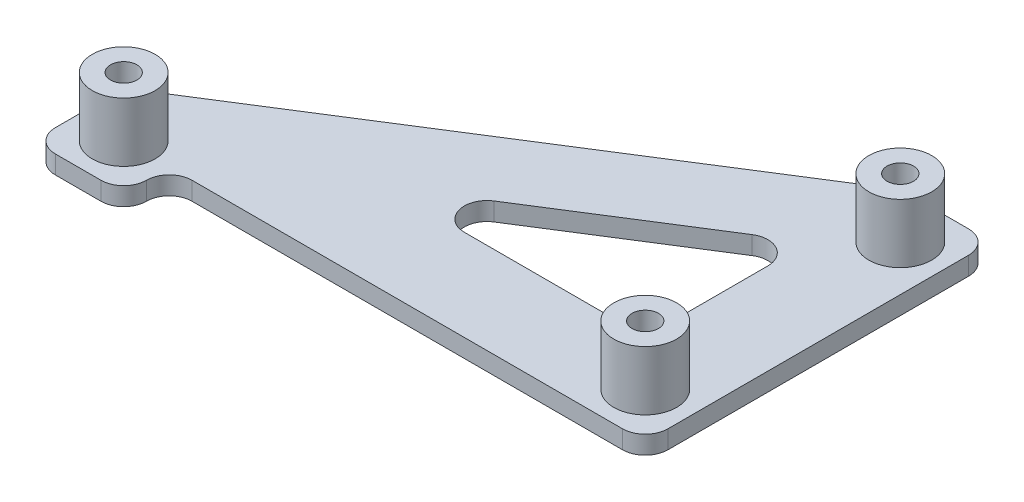
ISO-10303-21;
HEADER;
FILE_DESCRIPTION(('STEP AP214'),'2;1');
FILE_NAME('part.step','',(''),(''),'','','');
FILE_SCHEMA(('AUTOMOTIVE_DESIGN { 1 0 10303 214 1 1 1 1 }'));
ENDSEC;
DATA;
#1=APPLICATION_CONTEXT('core data for automotive mechanical design processes');
#2=APPLICATION_PROTOCOL_DEFINITION('international standard','automotive_design',2000,#1);
#3=PRODUCT_CONTEXT('',#1,'mechanical');
#4=PRODUCT('Part','Part','',(#3));
#5=PRODUCT_RELATED_PRODUCT_CATEGORY('part','',(#4));
#6=PRODUCT_DEFINITION_FORMATION('','',#4);
#7=PRODUCT_DEFINITION_CONTEXT('part definition',#1,'design');
#8=PRODUCT_DEFINITION('design','',#6,#7);
#9=PRODUCT_DEFINITION_SHAPE('','',#8);
#10=(LENGTH_UNIT() NAMED_UNIT(*) SI_UNIT(.MILLI.,.METRE.));
#11=(NAMED_UNIT(*) PLANE_ANGLE_UNIT() SI_UNIT($,.RADIAN.));
#12=(NAMED_UNIT(*) SI_UNIT($,.STERADIAN.) SOLID_ANGLE_UNIT());
#13=UNCERTAINTY_MEASURE_WITH_UNIT(LENGTH_MEASURE(1.E-05),#10,'distance_accuracy_value','');
#14=(GEOMETRIC_REPRESENTATION_CONTEXT(3) GLOBAL_UNCERTAINTY_ASSIGNED_CONTEXT((#13)) GLOBAL_UNIT_ASSIGNED_CONTEXT((#10,
#11,#12)) REPRESENTATION_CONTEXT('',''));
#15=CARTESIAN_POINT('',(0.,0.,0.));
#16=DIRECTION('',(0.,0.,1.));
#17=DIRECTION('',(1.,0.,0.));
#18=AXIS2_PLACEMENT_3D('',#15,#16,#17);
#19=CARTESIAN_POINT('',(0.,2.,0.));
#20=DIRECTION('',(0.,-1.,0.));
#21=DIRECTION('',(0.,0.,1.));
#22=AXIS2_PLACEMENT_3D('',#19,#20,#21);
#23=PLANE('',#22);
#24=CARTESIAN_POINT('',(0.,2.,0.));
#25=DIRECTION('',(0.,1.,0.));
#26=DIRECTION('',(0.,0.,1.));
#27=AXIS2_PLACEMENT_3D('',#24,#25,#26);
#28=CIRCLE('',#27,3.45);
#29=CARTESIAN_POINT('',(0.,2.,3.45));
#30=VERTEX_POINT('',#29);
#31=EDGE_CURVE('E254',#30,#30,#28,.F.);
#32=ORIENTED_EDGE('',*,*,#31,.T.);
#33=EDGE_LOOP('',(#32));
#34=FACE_BOUND('',#33,.T.);
#35=DIRECTION('',(-1.,0.,0.));
#36=VECTOR('',#35,1.);
#37=CARTESIAN_POINT('',(-5.,2.,-5.));
#38=LINE('',#37,#36);
#39=CARTESIAN_POINT('',(-7.5,2.,-5.));
#40=VERTEX_POINT('',#39);
#41=CARTESIAN_POINT('',(-24.8599572803658,2.,-5.));
#42=VERTEX_POINT('',#41);
#43=EDGE_CURVE('E179',#40,#42,#38,.T.);
#44=ORIENTED_EDGE('',*,*,#43,.T.);
#45=CARTESIAN_POINT('',(-24.8599572803658,2.,-7.5));
#46=DIRECTION('',(0.,1.,0.));
#47=DIRECTION('',(0.,0.,1.));
#48=AXIS2_PLACEMENT_3D('',#45,#46,#47);
#49=CIRCLE('',#48,2.5);
#50=CARTESIAN_POINT('',(-26.1949397588358,2.,-9.61372225757743));
#51=VERTEX_POINT('',#50);
#52=EDGE_CURVE('E194',#51,#42,#49,.T.);
#53=ORIENTED_EDGE('',*,*,#52,.F.);
#54=DIRECTION('',(0.845488903030971,0.,-0.533992991387981));
#55=VECTOR('',#54,1.);
#56=CARTESIAN_POINT('',(-33.5,2.,-5.));
#57=LINE('',#56,#55);
#58=CARTESIAN_POINT('',(-8.83498247846996,2.,-20.5779058030716));
#59=VERTEX_POINT('',#58);
#60=EDGE_CURVE('E379',#51,#59,#57,.T.);
#61=ORIENTED_EDGE('',*,*,#60,.T.);
#62=CARTESIAN_POINT('',(-7.5,2.,-18.4641835454942));
#63=DIRECTION('',(0.,1.,0.));
#64=DIRECTION('',(0.,0.,1.));
#65=AXIS2_PLACEMENT_3D('',#62,#63,#64);
#66=CIRCLE('',#65,2.5);
#67=CARTESIAN_POINT('',(-5.,2.,-18.4641835454942));
#68=VERTEX_POINT('',#67);
#69=EDGE_CURVE('E335',#68,#59,#66,.T.);
#70=ORIENTED_EDGE('',*,*,#69,.F.);
#71=DIRECTION('',(0.,0.,1.));
#72=VECTOR('',#71,1.);
#73=CARTESIAN_POINT('',(-5.,2.,-23.));
#74=LINE('',#73,#72);
#75=CARTESIAN_POINT('',(-5.,2.,-7.5));
#76=VERTEX_POINT('',#75);
#77=EDGE_CURVE('E211',#68,#76,#74,.T.);
#78=ORIENTED_EDGE('',*,*,#77,.T.);
#79=CARTESIAN_POINT('',(-7.5,2.,-7.5));
#80=DIRECTION('',(0.,1.,0.));
#81=DIRECTION('',(0.,0.,1.));
#82=AXIS2_PLACEMENT_3D('',#79,#80,#81);
#83=CIRCLE('',#82,2.5);
#84=EDGE_CURVE('E193',#40,#76,#83,.T.);
#85=ORIENTED_EDGE('',*,*,#84,.F.);
#86=EDGE_LOOP('',(#44,#53,#61,#70,#78,#85));
#87=FACE_BOUND('',#86,.T.);
#88=DIRECTION('',(0.845488903030971,0.,-0.533992991387982));
#89=VECTOR('',#88,1.);
#90=CARTESIAN_POINT('',(-4.99999999999999,2.,-33.));
#91=LINE('',#90,#89);
#92=CARTESIAN_POINT('',(-56.08498247847,2.,-0.73580053991372));
#93=VERTEX_POINT('',#92);
#94=CARTESIAN_POINT('',(-5.6116064255024,2.,-32.6137222575774));
#95=VERTEX_POINT('',#94);
#96=EDGE_CURVE('E230',#93,#95,#91,.T.);
#97=ORIENTED_EDGE('',*,*,#96,.F.);
#98=CARTESIAN_POINT('',(-54.75,2.,1.3779217176637));
#99=DIRECTION('',(0.,1.,0.));
#100=DIRECTION('',(0.,0.,1.));
#101=AXIS2_PLACEMENT_3D('',#98,#99,#100);
#102=CIRCLE('',#101,2.5);
#103=CARTESIAN_POINT('',(-57.25,2.,1.3779217176637));
#104=VERTEX_POINT('',#103);
#105=EDGE_CURVE('E309',#104,#93,#102,.F.);
#106=ORIENTED_EDGE('',*,*,#105,.F.);
#107=DIRECTION('',(0.,0.,-1.));
#108=VECTOR('',#107,1.);
#109=CARTESIAN_POINT('',(-57.25,2.,0.));
#110=LINE('',#109,#108);
#111=CARTESIAN_POINT('',(-57.25,2.,7.50000000000001));
#112=VERTEX_POINT('',#111);
#113=EDGE_CURVE('E228',#112,#104,#110,.T.);
#114=ORIENTED_EDGE('',*,*,#113,.F.);
#115=CARTESIAN_POINT('',(-54.75,2.,7.50000000000002));
#116=DIRECTION('',(0.,1.,0.));
#117=DIRECTION('',(0.,0.,1.));
#118=AXIS2_PLACEMENT_3D('',#115,#116,#117);
#119=CIRCLE('',#118,2.5);
#120=CARTESIAN_POINT('',(-54.75,2.,10.));
#121=VERTEX_POINT('',#120);
#122=EDGE_CURVE('E307',#121,#112,#119,.F.);
#123=ORIENTED_EDGE('',*,*,#122,.F.);
#124=DIRECTION('',(-1.,0.,0.));
#125=VECTOR('',#124,1.);
#126=CARTESIAN_POINT('',(-57.25,2.,10.));
#127=LINE('',#126,#125);
#128=CARTESIAN_POINT('',(-49.75,2.,10.));
#129=VERTEX_POINT('',#128);
#130=EDGE_CURVE('E225',#129,#121,#127,.T.);
#131=ORIENTED_EDGE('',*,*,#130,.F.);
#132=CARTESIAN_POINT('',(-49.75,2.,7.50000000000002));
#133=DIRECTION('',(0.,1.,0.));
#134=DIRECTION('',(0.,0.,1.));
#135=AXIS2_PLACEMENT_3D('',#132,#133,#134);
#136=CIRCLE('',#135,2.5);
#137=CARTESIAN_POINT('',(-47.25,2.,7.50000000000002));
#138=VERTEX_POINT('',#137);
#139=EDGE_CURVE('E298',#138,#129,#136,.F.);
#140=ORIENTED_EDGE('',*,*,#139,.F.);
#141=CARTESIAN_POINT('',(-44.75,2.,7.5));
#142=DIRECTION('',(0.,1.,0.));
#143=DIRECTION('',(0.,0.,1.));
#144=AXIS2_PLACEMENT_3D('',#141,#142,#143);
#145=CIRCLE('',#144,2.5);
#146=CARTESIAN_POINT('',(-44.75,2.,5.));
#147=VERTEX_POINT('',#146);
#148=EDGE_CURVE('E11',#147,#138,#145,.T.);
#149=ORIENTED_EDGE('',*,*,#148,.F.);
#150=DIRECTION('',(-1.,0.,0.));
#151=VECTOR('',#150,1.);
#152=CARTESIAN_POINT('',(-47.25,2.,5.));
#153=LINE('',#152,#151);
#154=CARTESIAN_POINT('',(2.5,2.,5.));
#155=VERTEX_POINT('',#154);
#156=EDGE_CURVE('E222',#155,#147,#153,.T.);
#157=ORIENTED_EDGE('',*,*,#156,.F.);
#158=CARTESIAN_POINT('',(2.5,2.,2.5));
#159=DIRECTION('',(0.,1.,0.));
#160=DIRECTION('',(0.,0.,1.));
#161=AXIS2_PLACEMENT_3D('',#158,#159,#160);
#162=CIRCLE('',#161,2.5);
#163=CARTESIAN_POINT('',(4.99999999999999,2.,2.5));
#164=VERTEX_POINT('',#163);
#165=EDGE_CURVE('E304',#164,#155,#162,.F.);
#166=ORIENTED_EDGE('',*,*,#165,.F.);
#167=DIRECTION('',(0.,0.,1.));
#168=VECTOR('',#167,1.);
#169=CARTESIAN_POINT('',(4.99999999999999,2.,5.));
#170=LINE('',#169,#168);
#171=CARTESIAN_POINT('',(5.,2.,-30.5));
#172=VERTEX_POINT('',#171);
#173=EDGE_CURVE('E218',#172,#164,#170,.T.);
#174=ORIENTED_EDGE('',*,*,#173,.F.);
#175=CARTESIAN_POINT('',(2.5,2.,-30.5));
#176=DIRECTION('',(0.,1.,0.));
#177=DIRECTION('',(0.,0.,1.));
#178=AXIS2_PLACEMENT_3D('',#175,#176,#177);
#179=CIRCLE('',#178,2.5);
#180=CARTESIAN_POINT('',(2.5,2.,-33.));
#181=VERTEX_POINT('',#180);
#182=EDGE_CURVE('E301',#181,#172,#179,.F.);
#183=ORIENTED_EDGE('',*,*,#182,.F.);
#184=DIRECTION('',(1.,0.,0.));
#185=VECTOR('',#184,1.);
#186=CARTESIAN_POINT('',(5.,2.,-33.));
#187=LINE('',#186,#185);
#188=CARTESIAN_POINT('',(-4.27662394703244,2.,-33.));
#189=VERTEX_POINT('',#188);
#190=EDGE_CURVE('E215',#189,#181,#187,.T.);
#191=ORIENTED_EDGE('',*,*,#190,.F.);
#192=CARTESIAN_POINT('',(-4.27662394703244,2.,-30.5));
#193=DIRECTION('',(0.,1.,0.));
#194=DIRECTION('',(0.,0.,1.));
#195=AXIS2_PLACEMENT_3D('',#192,#193,#194);
#196=CIRCLE('',#195,2.5);
#197=EDGE_CURVE('E311',#95,#189,#196,.F.);
#198=ORIENTED_EDGE('',*,*,#197,.F.);
#199=EDGE_LOOP('',(#97,#106,#114,#123,#131,#140,#149,#157,#166,#174,#183,#191,#198));
#200=FACE_BOUND('',#199,.T.);
#201=CARTESIAN_POINT('',(-52.25,2.,5.));
#202=DIRECTION('',(0.,1.,0.));
#203=DIRECTION('',(0.,0.,1.));
#204=AXIS2_PLACEMENT_3D('',#201,#202,#203);
#205=CIRCLE('',#204,3.45);
#206=CARTESIAN_POINT('',(-52.25,2.,8.45));
#207=VERTEX_POINT('',#206);
#208=EDGE_CURVE('E251',#207,#207,#205,.T.);
#209=ORIENTED_EDGE('',*,*,#208,.F.);
#210=EDGE_LOOP('',(#209));
#211=FACE_BOUND('',#210,.T.);
#212=CARTESIAN_POINT('',(0.,2.,-28.));
#213=DIRECTION('',(0.,1.,0.));
#214=DIRECTION('',(0.,0.,1.));
#215=AXIS2_PLACEMENT_3D('',#212,#213,#214);
#216=CIRCLE('',#215,3.45);
#217=CARTESIAN_POINT('',(0.,2.,-24.55));
#218=VERTEX_POINT('',#217);
#219=EDGE_CURVE('E184',#218,#218,#216,.F.);
#220=ORIENTED_EDGE('',*,*,#219,.T.);
#221=EDGE_LOOP('',(#220));
#222=FACE_BOUND('',#221,.T.);
#223=ADVANCED_FACE('F39',(#34,#87,#200,#211,#222),#23,.F.);
#224=CARTESIAN_POINT('',(-52.25,8.5,5.));
#225=DIRECTION('',(0.,-1.,0.));
#226=DIRECTION('',(0.,0.,1.));
#227=AXIS2_PLACEMENT_3D('',#224,#225,#226);
#228=CYLINDRICAL_SURFACE('',#227,3.45);
#229=CARTESIAN_POINT('',(-52.25,8.5,5.));
#230=DIRECTION('',(0.,-1.,0.));
#231=DIRECTION('',(0.,0.,-1.));
#232=AXIS2_PLACEMENT_3D('',#229,#230,#231);
#233=CIRCLE('',#232,3.45);
#234=CARTESIAN_POINT('',(-52.25,8.5,1.55));
#235=VERTEX_POINT('',#234);
#236=EDGE_CURVE('E255',#235,#235,#233,.T.);
#237=ORIENTED_EDGE('',*,*,#236,.T.);
#238=EDGE_LOOP('',(#237));
#239=FACE_BOUND('',#238,.T.);
#240=ORIENTED_EDGE('',*,*,#208,.T.);
#241=EDGE_LOOP('',(#240));
#242=FACE_BOUND('',#241,.T.);
#243=ADVANCED_FACE('F409',(#239,#242),#228,.T.);
#244=CARTESIAN_POINT('',(-52.25,8.5,5.));
#245=DIRECTION('',(0.,1.,0.));
#246=DIRECTION('',(0.,0.,-1.));
#247=AXIS2_PLACEMENT_3D('',#244,#245,#246);
#248=PLANE('',#247);
#249=ORIENTED_EDGE('',*,*,#236,.F.);
#250=EDGE_LOOP('',(#249));
#251=FACE_BOUND('',#250,.T.);
#252=CARTESIAN_POINT('',(-52.25,8.5,5.));
#253=DIRECTION('',(0.,-1.,0.));
#254=DIRECTION('',(0.,0.,-1.));
#255=AXIS2_PLACEMENT_3D('',#252,#253,#254);
#256=CIRCLE('',#255,1.45);
#257=CARTESIAN_POINT('',(-52.25,8.5,3.55));
#258=VERTEX_POINT('',#257);
#259=EDGE_CURVE('E256',#258,#258,#256,.T.);
#260=ORIENTED_EDGE('',*,*,#259,.T.);
#261=EDGE_LOOP('',(#260));
#262=FACE_BOUND('',#261,.T.);
#263=ADVANCED_FACE('F415',(#251,#262),#248,.T.);
#264=CARTESIAN_POINT('',(-52.25,0.,5.));
#265=DIRECTION('',(0.,1.,0.));
#266=DIRECTION('',(0.,0.,-1.));
#267=AXIS2_PLACEMENT_3D('',#264,#265,#266);
#268=PLANE('',#267);
#269=CARTESIAN_POINT('',(0.,0.,-28.));
#270=DIRECTION('',(0.,-1.,0.));
#271=DIRECTION('',(0.,0.,-1.));
#272=AXIS2_PLACEMENT_3D('',#269,#270,#271);
#273=CIRCLE('',#272,1.45);
#274=CARTESIAN_POINT('',(0.,0.,-29.45));
#275=VERTEX_POINT('',#274);
#276=EDGE_CURVE('E202',#275,#275,#273,.T.);
#277=ORIENTED_EDGE('',*,*,#276,.F.);
#278=EDGE_LOOP('',(#277));
#279=FACE_BOUND('',#278,.T.);
#280=CARTESIAN_POINT('',(-52.25,0.,5.));
#281=DIRECTION('',(0.,-1.,0.));
#282=DIRECTION('',(0.,0.,-1.));
#283=AXIS2_PLACEMENT_3D('',#280,#281,#282);
#284=CIRCLE('',#283,1.45);
#285=CARTESIAN_POINT('',(-52.25,0.,3.55));
#286=VERTEX_POINT('',#285);
#287=EDGE_CURVE('E233',#286,#286,#284,.T.);
#288=ORIENTED_EDGE('',*,*,#287,.F.);
#289=EDGE_LOOP('',(#288));
#290=FACE_BOUND('',#289,.T.);
#291=DIRECTION('',(1.,0.,0.));
#292=VECTOR('',#291,1.);
#293=CARTESIAN_POINT('',(5.,0.,-33.));
#294=LINE('',#293,#292);
#295=CARTESIAN_POINT('',(-4.27662394703244,0.,-33.));
#296=VERTEX_POINT('',#295);
#297=CARTESIAN_POINT('',(2.5,0.,-33.));
#298=VERTEX_POINT('',#297);
#299=EDGE_CURVE('E234',#296,#298,#294,.T.);
#300=ORIENTED_EDGE('',*,*,#299,.T.);
#301=CARTESIAN_POINT('',(2.5,0.,-30.5));
#302=DIRECTION('',(0.,-1.,0.));
#303=DIRECTION('',(0.,0.,-1.));
#304=AXIS2_PLACEMENT_3D('',#301,#302,#303);
#305=CIRCLE('',#304,2.5);
#306=CARTESIAN_POINT('',(5.,0.,-30.5));
#307=VERTEX_POINT('',#306);
#308=EDGE_CURVE('E280',#307,#298,#305,.F.);
#309=ORIENTED_EDGE('',*,*,#308,.F.);
#310=DIRECTION('',(0.,0.,1.));
#311=VECTOR('',#310,1.);
#312=CARTESIAN_POINT('',(4.99999999999999,0.,5.));
#313=LINE('',#312,#311);
#314=CARTESIAN_POINT('',(4.99999999999999,0.,2.5));
#315=VERTEX_POINT('',#314);
#316=EDGE_CURVE('E237',#307,#315,#313,.T.);
#317=ORIENTED_EDGE('',*,*,#316,.T.);
#318=CARTESIAN_POINT('',(2.5,0.,2.5));
#319=DIRECTION('',(0.,-1.,0.));
#320=DIRECTION('',(0.,0.,-1.));
#321=AXIS2_PLACEMENT_3D('',#318,#319,#320);
#322=CIRCLE('',#321,2.5);
#323=CARTESIAN_POINT('',(2.5,0.,5.));
#324=VERTEX_POINT('',#323);
#325=EDGE_CURVE('E283',#324,#315,#322,.F.);
#326=ORIENTED_EDGE('',*,*,#325,.F.);
#327=DIRECTION('',(-1.,0.,0.));
#328=VECTOR('',#327,1.);
#329=CARTESIAN_POINT('',(-47.25,0.,5.));
#330=LINE('',#329,#328);
#331=CARTESIAN_POINT('',(-44.75,0.,5.));
#332=VERTEX_POINT('',#331);
#333=EDGE_CURVE('E240',#324,#332,#330,.T.);
#334=ORIENTED_EDGE('',*,*,#333,.T.);
#335=CARTESIAN_POINT('',(-44.75,0.,7.5));
#336=DIRECTION('',(0.,-1.,0.));
#337=DIRECTION('',(0.,0.,-1.));
#338=AXIS2_PLACEMENT_3D('',#335,#336,#337);
#339=CIRCLE('',#338,2.5);
#340=CARTESIAN_POINT('',(-47.25,0.,7.50000000000002));
#341=VERTEX_POINT('',#340);
#342=EDGE_CURVE('E48',#341,#332,#339,.T.);
#343=ORIENTED_EDGE('',*,*,#342,.F.);
#344=CARTESIAN_POINT('',(-49.75,0.,7.50000000000002));
#345=DIRECTION('',(0.,-1.,0.));
#346=DIRECTION('',(0.,0.,-1.));
#347=AXIS2_PLACEMENT_3D('',#344,#345,#346);
#348=CIRCLE('',#347,2.5);
#349=CARTESIAN_POINT('',(-49.75,0.,10.));
#350=VERTEX_POINT('',#349);
#351=EDGE_CURVE('E277',#350,#341,#348,.F.);
#352=ORIENTED_EDGE('',*,*,#351,.F.);
#353=DIRECTION('',(-1.,0.,0.));
#354=VECTOR('',#353,1.);
#355=CARTESIAN_POINT('',(-57.25,0.,10.));
#356=LINE('',#355,#354);
#357=CARTESIAN_POINT('',(-54.75,0.,10.));
#358=VERTEX_POINT('',#357);
#359=EDGE_CURVE('E243',#350,#358,#356,.T.);
#360=ORIENTED_EDGE('',*,*,#359,.T.);
#361=CARTESIAN_POINT('',(-54.75,0.,7.50000000000002));
#362=DIRECTION('',(0.,-1.,0.));
#363=DIRECTION('',(0.,0.,-1.));
#364=AXIS2_PLACEMENT_3D('',#361,#362,#363);
#365=CIRCLE('',#364,2.5);
#366=CARTESIAN_POINT('',(-57.25,0.,7.50000000000001));
#367=VERTEX_POINT('',#366);
#368=EDGE_CURVE('E286',#367,#358,#365,.F.);
#369=ORIENTED_EDGE('',*,*,#368,.F.);
#370=DIRECTION('',(0.,0.,-1.));
#371=VECTOR('',#370,1.);
#372=CARTESIAN_POINT('',(-57.25,0.,0.));
#373=LINE('',#372,#371);
#374=CARTESIAN_POINT('',(-57.25,0.,1.3779217176637));
#375=VERTEX_POINT('',#374);
#376=EDGE_CURVE('E246',#367,#375,#373,.T.);
#377=ORIENTED_EDGE('',*,*,#376,.T.);
#378=CARTESIAN_POINT('',(-54.75,0.,1.3779217176637));
#379=DIRECTION('',(0.,-1.,0.));
#380=DIRECTION('',(0.,0.,-1.));
#381=AXIS2_PLACEMENT_3D('',#378,#379,#380);
#382=CIRCLE('',#381,2.5);
#383=CARTESIAN_POINT('',(-56.08498247847,0.,-0.73580053991372));
#384=VERTEX_POINT('',#383);
#385=EDGE_CURVE('E289',#384,#375,#382,.F.);
#386=ORIENTED_EDGE('',*,*,#385,.F.);
#387=DIRECTION('',(0.845488903030971,0.,-0.533992991387982));
#388=VECTOR('',#387,1.);
#389=CARTESIAN_POINT('',(-4.99999999999999,0.,-33.));
#390=LINE('',#389,#388);
#391=CARTESIAN_POINT('',(-5.6116064255024,0.,-32.6137222575774));
#392=VERTEX_POINT('',#391);
#393=EDGE_CURVE('E219',#384,#392,#390,.T.);
#394=ORIENTED_EDGE('',*,*,#393,.T.);
#395=CARTESIAN_POINT('',(-4.27662394703244,0.,-30.5));
#396=DIRECTION('',(0.,-1.,0.));
#397=DIRECTION('',(0.,0.,-1.));
#398=AXIS2_PLACEMENT_3D('',#395,#396,#397);
#399=CIRCLE('',#398,2.5);
#400=EDGE_CURVE('E291',#296,#392,#399,.F.);
#401=ORIENTED_EDGE('',*,*,#400,.F.);
#402=EDGE_LOOP('',(#300,#309,#317,#326,#334,#343,#352,#360,#369,#377,#386,#394,#401));
#403=FACE_BOUND('',#402,.T.);
#404=DIRECTION('',(0.845488903030971,0.,-0.533992991387981));
#405=VECTOR('',#404,1.);
#406=CARTESIAN_POINT('',(-33.5,0.,-5.));
#407=LINE('',#406,#405);
#408=CARTESIAN_POINT('',(-26.1949397588358,0.,-9.61372225757743));
#409=VERTEX_POINT('',#408);
#410=CARTESIAN_POINT('',(-8.83498247846996,0.,-20.5779058030716));
#411=VERTEX_POINT('',#410);
#412=EDGE_CURVE('E201',#409,#411,#407,.T.);
#413=ORIENTED_EDGE('',*,*,#412,.F.);
#414=CARTESIAN_POINT('',(-24.8599572803658,0.,-7.5));
#415=DIRECTION('',(0.,-1.,0.));
#416=DIRECTION('',(0.,0.,-1.));
#417=AXIS2_PLACEMENT_3D('',#414,#415,#416);
#418=CIRCLE('',#417,2.5);
#419=CARTESIAN_POINT('',(-24.8599572803658,0.,-5.));
#420=VERTEX_POINT('',#419);
#421=EDGE_CURVE('E200',#420,#409,#418,.T.);
#422=ORIENTED_EDGE('',*,*,#421,.F.);
#423=DIRECTION('',(-1.,0.,0.));
#424=VECTOR('',#423,1.);
#425=CARTESIAN_POINT('',(-5.,0.,-5.));
#426=LINE('',#425,#424);
#427=CARTESIAN_POINT('',(-7.5,0.,-5.));
#428=VERTEX_POINT('',#427);
#429=EDGE_CURVE('E176',#428,#420,#426,.T.);
#430=ORIENTED_EDGE('',*,*,#429,.F.);
#431=CARTESIAN_POINT('',(-7.5,0.,-7.5));
#432=DIRECTION('',(0.,-1.,0.));
#433=DIRECTION('',(0.,0.,-1.));
#434=AXIS2_PLACEMENT_3D('',#431,#432,#433);
#435=CIRCLE('',#434,2.5);
#436=CARTESIAN_POINT('',(-5.,0.,-7.5));
#437=VERTEX_POINT('',#436);
#438=EDGE_CURVE('E187',#437,#428,#435,.T.);
#439=ORIENTED_EDGE('',*,*,#438,.F.);
#440=DIRECTION('',(0.,0.,1.));
#441=VECTOR('',#440,1.);
#442=CARTESIAN_POINT('',(-5.,0.,-23.));
#443=LINE('',#442,#441);
#444=CARTESIAN_POINT('',(-5.,0.,-18.4641835454942));
#445=VERTEX_POINT('',#444);
#446=EDGE_CURVE('E205',#445,#437,#443,.T.);
#447=ORIENTED_EDGE('',*,*,#446,.F.);
#448=CARTESIAN_POINT('',(-7.5,0.,-18.4641835454942));
#449=DIRECTION('',(0.,-1.,0.));
#450=DIRECTION('',(0.,0.,-1.));
#451=AXIS2_PLACEMENT_3D('',#448,#449,#450);
#452=CIRCLE('',#451,2.5);
#453=EDGE_CURVE('E332',#411,#445,#452,.T.);
#454=ORIENTED_EDGE('',*,*,#453,.F.);
#455=EDGE_LOOP('',(#413,#422,#430,#439,#447,#454));
#456=FACE_BOUND('',#455,.T.);
#457=CARTESIAN_POINT('',(0.,0.,0.));
#458=DIRECTION('',(0.,-1.,0.));
#459=DIRECTION('',(0.,0.,-1.));
#460=AXIS2_PLACEMENT_3D('',#457,#458,#459);
#461=CIRCLE('',#460,1.45);
#462=CARTESIAN_POINT('',(0.,0.,-1.45));
#463=VERTEX_POINT('',#462);
#464=EDGE_CURVE('E208',#463,#463,#461,.T.);
#465=ORIENTED_EDGE('',*,*,#464,.F.);
#466=EDGE_LOOP('',(#465));
#467=FACE_BOUND('',#466,.T.);
#468=ADVANCED_FACE('F197',(#279,#290,#403,#456,#467),#268,.F.);
#469=CARTESIAN_POINT('',(-52.25,8.5,5.));
#470=DIRECTION('',(0.,-1.,0.));
#471=DIRECTION('',(0.,0.,1.));
#472=AXIS2_PLACEMENT_3D('',#469,#470,#471);
#473=CYLINDRICAL_SURFACE('',#472,1.45);
#474=ORIENTED_EDGE('',*,*,#287,.T.);
#475=EDGE_LOOP('',(#474));
#476=FACE_BOUND('',#475,.T.);
#477=ORIENTED_EDGE('',*,*,#259,.F.);
#478=EDGE_LOOP('',(#477));
#479=FACE_BOUND('',#478,.T.);
#480=ADVANCED_FACE('F440',(#476,#479),#473,.F.);
#481=CARTESIAN_POINT('',(5.,2.,-33.));
#482=DIRECTION('',(0.,0.,1.));
#483=DIRECTION('',(-1.,0.,0.));
#484=AXIS2_PLACEMENT_3D('',#481,#482,#483);
#485=PLANE('',#484);
#486=ORIENTED_EDGE('',*,*,#190,.T.);
#487=DIRECTION('',(0.,-1.,0.));
#488=VECTOR('',#487,1.);
#489=CARTESIAN_POINT('',(2.5,2.,-33.));
#490=LINE('',#489,#488);
#491=EDGE_CURVE('E273',#298,#181,#490,.F.);
#492=ORIENTED_EDGE('',*,*,#491,.F.);
#493=ORIENTED_EDGE('',*,*,#299,.F.);
#494=DIRECTION('',(0.,-1.,0.));
#495=VECTOR('',#494,1.);
#496=CARTESIAN_POINT('',(-4.27662394703244,2.,-33.));
#497=LINE('',#496,#495);
#498=EDGE_CURVE('E275',#189,#296,#497,.T.);
#499=ORIENTED_EDGE('',*,*,#498,.F.);
#500=EDGE_LOOP('',(#486,#492,#493,#499));
#501=FACE_BOUND('',#500,.T.);
#502=ADVANCED_FACE('F436',(#501),#485,.F.);
#503=CARTESIAN_POINT('',(4.99999999999999,2.,5.));
#504=DIRECTION('',(-1.,0.,0.));
#505=DIRECTION('',(0.,0.,-1.));
#506=AXIS2_PLACEMENT_3D('',#503,#504,#505);
#507=PLANE('',#506);
#508=ORIENTED_EDGE('',*,*,#316,.F.);
#509=DIRECTION('',(0.,-1.,0.));
#510=VECTOR('',#509,1.);
#511=CARTESIAN_POINT('',(5.,2.,-30.5));
#512=LINE('',#511,#510);
#513=EDGE_CURVE('E324',#172,#307,#512,.T.);
#514=ORIENTED_EDGE('',*,*,#513,.F.);
#515=ORIENTED_EDGE('',*,*,#173,.T.);
#516=DIRECTION('',(0.,-1.,0.));
#517=VECTOR('',#516,1.);
#518=CARTESIAN_POINT('',(4.99999999999999,2.,2.5));
#519=LINE('',#518,#517);
#520=EDGE_CURVE('E326',#315,#164,#519,.F.);
#521=ORIENTED_EDGE('',*,*,#520,.F.);
#522=EDGE_LOOP('',(#508,#514,#515,#521));
#523=FACE_BOUND('',#522,.T.);
#524=ADVANCED_FACE('F433',(#523),#507,.F.);
#525=CARTESIAN_POINT('',(-47.25,2.,5.));
#526=DIRECTION('',(0.,0.,-1.));
#527=DIRECTION('',(1.,0.,0.));
#528=AXIS2_PLACEMENT_3D('',#525,#526,#527);
#529=PLANE('',#528);
#530=ORIENTED_EDGE('',*,*,#333,.F.);
#531=DIRECTION('',(0.,-1.,0.));
#532=VECTOR('',#531,1.);
#533=CARTESIAN_POINT('',(2.5,2.,5.));
#534=LINE('',#533,#532);
#535=EDGE_CURVE('E320',#155,#324,#534,.T.);
#536=ORIENTED_EDGE('',*,*,#535,.F.);
#537=ORIENTED_EDGE('',*,*,#156,.T.);
#538=DIRECTION('',(0.,-1.,0.));
#539=VECTOR('',#538,1.);
#540=CARTESIAN_POINT('',(-44.75,2.,5.));
#541=LINE('',#540,#539);
#542=EDGE_CURVE('E322',#332,#147,#541,.F.);
#543=ORIENTED_EDGE('',*,*,#542,.F.);
#544=EDGE_LOOP('',(#530,#536,#537,#543));
#545=FACE_BOUND('',#544,.T.);
#546=ADVANCED_FACE('F347',(#545),#529,.F.);
#547=CARTESIAN_POINT('',(-57.25,2.,10.));
#548=DIRECTION('',(0.,0.,-1.));
#549=DIRECTION('',(1.,0.,0.));
#550=AXIS2_PLACEMENT_3D('',#547,#548,#549);
#551=PLANE('',#550);
#552=ORIENTED_EDGE('',*,*,#359,.F.);
#553=DIRECTION('',(0.,-1.,0.));
#554=VECTOR('',#553,1.);
#555=CARTESIAN_POINT('',(-49.75,2.,10.));
#556=LINE('',#555,#554);
#557=EDGE_CURVE('E316',#129,#350,#556,.T.);
#558=ORIENTED_EDGE('',*,*,#557,.F.);
#559=ORIENTED_EDGE('',*,*,#130,.T.);
#560=DIRECTION('',(0.,-1.,0.));
#561=VECTOR('',#560,1.);
#562=CARTESIAN_POINT('',(-54.75,2.,10.));
#563=LINE('',#562,#561);
#564=EDGE_CURVE('E318',#358,#121,#563,.F.);
#565=ORIENTED_EDGE('',*,*,#564,.F.);
#566=EDGE_LOOP('',(#552,#558,#559,#565));
#567=FACE_BOUND('',#566,.T.);
#568=ADVANCED_FACE('F427',(#567),#551,.F.);
#569=CARTESIAN_POINT('',(-57.25,2.,0.));
#570=DIRECTION('',(1.,0.,0.));
#571=DIRECTION('',(0.,0.,1.));
#572=AXIS2_PLACEMENT_3D('',#569,#570,#571);
#573=PLANE('',#572);
#574=ORIENTED_EDGE('',*,*,#376,.F.);
#575=DIRECTION('',(0.,-1.,0.));
#576=VECTOR('',#575,1.);
#577=CARTESIAN_POINT('',(-57.25,2.,7.50000000000001));
#578=LINE('',#577,#576);
#579=EDGE_CURVE('E62',#112,#367,#578,.T.);
#580=ORIENTED_EDGE('',*,*,#579,.F.);
#581=ORIENTED_EDGE('',*,*,#113,.T.);
#582=DIRECTION('',(0.,-1.,0.));
#583=VECTOR('',#582,1.);
#584=CARTESIAN_POINT('',(-57.25,2.,1.3779217176637));
#585=LINE('',#584,#583);
#586=EDGE_CURVE('E55',#375,#104,#585,.F.);
#587=ORIENTED_EDGE('',*,*,#586,.F.);
#588=EDGE_LOOP('',(#574,#580,#581,#587));
#589=FACE_BOUND('',#588,.T.);
#590=ADVANCED_FACE('F423',(#589),#573,.F.);
#591=CARTESIAN_POINT('',(-4.99999999999999,2.,-33.));
#592=DIRECTION('',(0.533992991387982,0.,0.845488903030971));
#593=DIRECTION('',(-0.845488903030971,0.,0.533992991387982));
#594=AXIS2_PLACEMENT_3D('',#591,#592,#593);
#595=PLANE('',#594);
#596=ORIENTED_EDGE('',*,*,#393,.F.);
#597=DIRECTION('',(0.,-1.,0.));
#598=VECTOR('',#597,1.);
#599=CARTESIAN_POINT('',(-56.08498247847,2.,-0.735800539913727));
#600=LINE('',#599,#598);
#601=EDGE_CURVE('E294',#93,#384,#600,.T.);
#602=ORIENTED_EDGE('',*,*,#601,.F.);
#603=ORIENTED_EDGE('',*,*,#96,.T.);
#604=DIRECTION('',(0.,-1.,0.));
#605=VECTOR('',#604,1.);
#606=CARTESIAN_POINT('',(-5.6116064255024,2.,-32.6137222575774));
#607=LINE('',#606,#605);
#608=EDGE_CURVE('E296',#392,#95,#607,.F.);
#609=ORIENTED_EDGE('',*,*,#608,.F.);
#610=EDGE_LOOP('',(#596,#602,#603,#609));
#611=FACE_BOUND('',#610,.T.);
#612=ADVANCED_FACE('F420',(#611),#595,.F.);
#613=CARTESIAN_POINT('',(-5.,2.,-5.));
#614=DIRECTION('',(0.,0.,-1.));
#615=DIRECTION('',(1.,0.,0.));
#616=AXIS2_PLACEMENT_3D('',#613,#614,#615);
#617=PLANE('',#616);
#618=ORIENTED_EDGE('',*,*,#43,.F.);
#619=DIRECTION('',(0.,-1.,0.));
#620=VECTOR('',#619,1.);
#621=CARTESIAN_POINT('',(-7.5,2.,-5.));
#622=LINE('',#621,#620);
#623=EDGE_CURVE('E172',#428,#40,#622,.F.);
#624=ORIENTED_EDGE('',*,*,#623,.F.);
#625=ORIENTED_EDGE('',*,*,#429,.T.);
#626=DIRECTION('',(0.,-1.,0.));
#627=VECTOR('',#626,1.);
#628=CARTESIAN_POINT('',(-24.8599572803658,0.,-5.));
#629=LINE('',#628,#627);
#630=EDGE_CURVE('E183',#42,#420,#629,.T.);
#631=ORIENTED_EDGE('',*,*,#630,.F.);
#632=EDGE_LOOP('',(#618,#624,#625,#631));
#633=FACE_BOUND('',#632,.T.);
#634=ADVANCED_FACE('F174',(#633),#617,.T.);
#635=CARTESIAN_POINT('',(-33.5,2.,-5.));
#636=DIRECTION('',(0.533992991387982,0.,0.845488903030971));
#637=DIRECTION('',(-0.845488903030971,0.,0.533992991387981));
#638=AXIS2_PLACEMENT_3D('',#635,#636,#637);
#639=PLANE('',#638);
#640=ORIENTED_EDGE('',*,*,#412,.T.);
#641=DIRECTION('',(0.,-1.,0.));
#642=VECTOR('',#641,1.);
#643=CARTESIAN_POINT('',(-8.83498247846996,0.,-20.5779058030716));
#644=LINE('',#643,#642);
#645=EDGE_CURVE('E266',#59,#411,#644,.T.);
#646=ORIENTED_EDGE('',*,*,#645,.F.);
#647=ORIENTED_EDGE('',*,*,#60,.F.);
#648=DIRECTION('',(0.,-1.,0.));
#649=VECTOR('',#648,1.);
#650=CARTESIAN_POINT('',(-26.1949397588358,2.,-9.61372225757743));
#651=LINE('',#650,#649);
#652=EDGE_CURVE('E268',#409,#51,#651,.F.);
#653=ORIENTED_EDGE('',*,*,#652,.F.);
#654=EDGE_LOOP('',(#640,#646,#647,#653));
#655=FACE_BOUND('',#654,.T.);
#656=ADVANCED_FACE('F392',(#655),#639,.T.);
#657=CARTESIAN_POINT('',(-5.,2.,-23.));
#658=DIRECTION('',(-1.,0.,0.));
#659=DIRECTION('',(0.,0.,-1.));
#660=AXIS2_PLACEMENT_3D('',#657,#658,#659);
#661=PLANE('',#660);
#662=ORIENTED_EDGE('',*,*,#77,.F.);
#663=DIRECTION('',(0.,-1.,0.));
#664=VECTOR('',#663,1.);
#665=CARTESIAN_POINT('',(-5.,2.,-18.4641835454942));
#666=LINE('',#665,#664);
#667=EDGE_CURVE('E270',#445,#68,#666,.F.);
#668=ORIENTED_EDGE('',*,*,#667,.F.);
#669=ORIENTED_EDGE('',*,*,#446,.T.);
#670=DIRECTION('',(0.,-1.,0.));
#671=VECTOR('',#670,1.);
#672=CARTESIAN_POINT('',(-5.,0.,-7.5));
#673=LINE('',#672,#671);
#674=EDGE_CURVE('E189',#76,#437,#673,.T.);
#675=ORIENTED_EDGE('',*,*,#674,.F.);
#676=EDGE_LOOP('',(#662,#668,#669,#675));
#677=FACE_BOUND('',#676,.T.);
#678=ADVANCED_FACE('F388',(#677),#661,.T.);
#679=CARTESIAN_POINT('',(0.,2.,-28.));
#680=DIRECTION('',(0.,-1.,0.));
#681=DIRECTION('',(0.,0.,1.));
#682=AXIS2_PLACEMENT_3D('',#679,#680,#681);
#683=CYLINDRICAL_SURFACE('',#682,1.45);
#684=ORIENTED_EDGE('',*,*,#276,.T.);
#685=EDGE_LOOP('',(#684));
#686=FACE_BOUND('',#685,.T.);
#687=CARTESIAN_POINT('',(0.,8.5,-28.));
#688=DIRECTION('',(0.,-1.,0.));
#689=DIRECTION('',(0.,0.,-1.));
#690=AXIS2_PLACEMENT_3D('',#687,#688,#689);
#691=CIRCLE('',#690,1.45);
#692=CARTESIAN_POINT('',(0.,8.5,-29.45));
#693=VERTEX_POINT('',#692);
#694=EDGE_CURVE('E362',#693,#693,#691,.T.);
#695=ORIENTED_EDGE('',*,*,#694,.F.);
#696=EDGE_LOOP('',(#695));
#697=FACE_BOUND('',#696,.T.);
#698=ADVANCED_FACE('F459',(#686,#697),#683,.F.);
#699=CARTESIAN_POINT('',(0.,2.,0.));
#700=DIRECTION('',(0.,-1.,0.));
#701=DIRECTION('',(0.,0.,1.));
#702=AXIS2_PLACEMENT_3D('',#699,#700,#701);
#703=CYLINDRICAL_SURFACE('',#702,1.45);
#704=ORIENTED_EDGE('',*,*,#464,.T.);
#705=EDGE_LOOP('',(#704));
#706=FACE_BOUND('',#705,.T.);
#707=CARTESIAN_POINT('',(0.,8.5,0.));
#708=DIRECTION('',(0.,-1.,0.));
#709=DIRECTION('',(0.,0.,-1.));
#710=AXIS2_PLACEMENT_3D('',#707,#708,#709);
#711=CIRCLE('',#710,1.45);
#712=CARTESIAN_POINT('',(0.,8.5,-1.45));
#713=VERTEX_POINT('',#712);
#714=EDGE_CURVE('E374',#713,#713,#711,.T.);
#715=ORIENTED_EDGE('',*,*,#714,.F.);
#716=EDGE_LOOP('',(#715));
#717=FACE_BOUND('',#716,.T.);
#718=ADVANCED_FACE('F462',(#706,#717),#703,.F.);
#719=CARTESIAN_POINT('',(0.,8.5,0.));
#720=DIRECTION('',(0.,-1.,0.));
#721=DIRECTION('',(0.,0.,1.));
#722=AXIS2_PLACEMENT_3D('',#719,#720,#721);
#723=CYLINDRICAL_SURFACE('',#722,3.45);
#724=CARTESIAN_POINT('',(0.,8.5,0.));
#725=DIRECTION('',(0.,-1.,0.));
#726=DIRECTION('',(0.,0.,-1.));
#727=AXIS2_PLACEMENT_3D('',#724,#725,#726);
#728=CIRCLE('',#727,3.45);
#729=CARTESIAN_POINT('',(0.,8.5,-3.45));
#730=VERTEX_POINT('',#729);
#731=EDGE_CURVE('E367',#730,#730,#728,.T.);
#732=ORIENTED_EDGE('',*,*,#731,.T.);
#733=EDGE_LOOP('',(#732));
#734=FACE_BOUND('',#733,.T.);
#735=ORIENTED_EDGE('',*,*,#31,.F.);
#736=EDGE_LOOP('',(#735));
#737=FACE_BOUND('',#736,.T.);
#738=ADVANCED_FACE('F470',(#734,#737),#723,.T.);
#739=CARTESIAN_POINT('',(0.,8.5,0.));
#740=DIRECTION('',(0.,1.,0.));
#741=DIRECTION('',(0.,0.,-1.));
#742=AXIS2_PLACEMENT_3D('',#739,#740,#741);
#743=PLANE('',#742);
#744=ORIENTED_EDGE('',*,*,#731,.F.);
#745=EDGE_LOOP('',(#744));
#746=FACE_BOUND('',#745,.T.);
#747=ORIENTED_EDGE('',*,*,#714,.T.);
#748=EDGE_LOOP('',(#747));
#749=FACE_BOUND('',#748,.T.);
#750=ADVANCED_FACE('F549',(#746,#749),#743,.T.);
#751=CARTESIAN_POINT('',(0.,8.5,-28.));
#752=DIRECTION('',(0.,-1.,0.));
#753=DIRECTION('',(0.,0.,1.));
#754=AXIS2_PLACEMENT_3D('',#751,#752,#753);
#755=CYLINDRICAL_SURFACE('',#754,3.45);
#756=CARTESIAN_POINT('',(0.,8.5,-28.));
#757=DIRECTION('',(0.,-1.,0.));
#758=DIRECTION('',(0.,0.,-1.));
#759=AXIS2_PLACEMENT_3D('',#756,#757,#758);
#760=CIRCLE('',#759,3.45);
#761=CARTESIAN_POINT('',(0.,8.5,-31.45));
#762=VERTEX_POINT('',#761);
#763=EDGE_CURVE('E360',#762,#762,#760,.T.);
#764=ORIENTED_EDGE('',*,*,#763,.T.);
#765=EDGE_LOOP('',(#764));
#766=FACE_BOUND('',#765,.T.);
#767=ORIENTED_EDGE('',*,*,#219,.F.);
#768=EDGE_LOOP('',(#767));
#769=FACE_BOUND('',#768,.T.);
#770=ADVANCED_FACE('F404',(#766,#769),#755,.T.);
#771=CARTESIAN_POINT('',(0.,8.5,-28.));
#772=DIRECTION('',(0.,1.,0.));
#773=DIRECTION('',(0.,0.,-1.));
#774=AXIS2_PLACEMENT_3D('',#771,#772,#773);
#775=PLANE('',#774);
#776=ORIENTED_EDGE('',*,*,#763,.F.);
#777=EDGE_LOOP('',(#776));
#778=FACE_BOUND('',#777,.T.);
#779=ORIENTED_EDGE('',*,*,#694,.T.);
#780=EDGE_LOOP('',(#779));
#781=FACE_BOUND('',#780,.T.);
#782=ADVANCED_FACE('F396',(#778,#781),#775,.T.);
#783=CARTESIAN_POINT('',(-24.8599572803658,2.,-7.5));
#784=DIRECTION('',(0.,1.,0.));
#785=DIRECTION('',(0.,0.,-1.));
#786=AXIS2_PLACEMENT_3D('',#783,#784,#785);
#787=CYLINDRICAL_SURFACE('',#786,2.5);
#788=ORIENTED_EDGE('',*,*,#52,.T.);
#789=ORIENTED_EDGE('',*,*,#630,.T.);
#790=ORIENTED_EDGE('',*,*,#421,.T.);
#791=ORIENTED_EDGE('',*,*,#652,.T.);
#792=EDGE_LOOP('',(#788,#789,#790,#791));
#793=FACE_BOUND('',#792,.T.);
#794=ADVANCED_FACE('F394',(#793),#787,.F.);
#795=CARTESIAN_POINT('',(-7.5,2.,-7.5));
#796=DIRECTION('',(0.,1.,0.));
#797=DIRECTION('',(0.,0.,-1.));
#798=AXIS2_PLACEMENT_3D('',#795,#796,#797);
#799=CYLINDRICAL_SURFACE('',#798,2.5);
#800=ORIENTED_EDGE('',*,*,#84,.T.);
#801=ORIENTED_EDGE('',*,*,#674,.T.);
#802=ORIENTED_EDGE('',*,*,#438,.T.);
#803=ORIENTED_EDGE('',*,*,#623,.T.);
#804=EDGE_LOOP('',(#800,#801,#802,#803));
#805=FACE_BOUND('',#804,.T.);
#806=ADVANCED_FACE('F188',(#805),#799,.F.);
#807=CARTESIAN_POINT('',(-7.5,2.,-18.4641835454942));
#808=DIRECTION('',(0.,1.,0.));
#809=DIRECTION('',(0.,0.,-1.));
#810=AXIS2_PLACEMENT_3D('',#807,#808,#809);
#811=CYLINDRICAL_SURFACE('',#810,2.5);
#812=ORIENTED_EDGE('',*,*,#69,.T.);
#813=ORIENTED_EDGE('',*,*,#645,.T.);
#814=ORIENTED_EDGE('',*,*,#453,.T.);
#815=ORIENTED_EDGE('',*,*,#667,.T.);
#816=EDGE_LOOP('',(#812,#813,#814,#815));
#817=FACE_BOUND('',#816,.T.);
#818=ADVANCED_FACE('F402',(#817),#811,.F.);
#819=CARTESIAN_POINT('',(-4.27662394703244,2.,-30.5));
#820=DIRECTION('',(0.,-1.,0.));
#821=DIRECTION('',(0.,0.,1.));
#822=AXIS2_PLACEMENT_3D('',#819,#820,#821);
#823=CYLINDRICAL_SURFACE('',#822,2.5);
#824=ORIENTED_EDGE('',*,*,#197,.T.);
#825=ORIENTED_EDGE('',*,*,#498,.T.);
#826=ORIENTED_EDGE('',*,*,#400,.T.);
#827=ORIENTED_EDGE('',*,*,#608,.T.);
#828=EDGE_LOOP('',(#824,#825,#826,#827));
#829=FACE_BOUND('',#828,.T.);
#830=ADVANCED_FACE('F630',(#829),#823,.T.);
#831=CARTESIAN_POINT('',(-54.75,2.,1.3779217176637));
#832=DIRECTION('',(0.,-1.,0.));
#833=DIRECTION('',(0.,0.,1.));
#834=AXIS2_PLACEMENT_3D('',#831,#832,#833);
#835=CYLINDRICAL_SURFACE('',#834,2.5);
#836=ORIENTED_EDGE('',*,*,#105,.T.);
#837=ORIENTED_EDGE('',*,*,#601,.T.);
#838=ORIENTED_EDGE('',*,*,#385,.T.);
#839=ORIENTED_EDGE('',*,*,#586,.T.);
#840=EDGE_LOOP('',(#836,#837,#838,#839));
#841=FACE_BOUND('',#840,.T.);
#842=ADVANCED_FACE('F639',(#841),#835,.T.);
#843=CARTESIAN_POINT('',(-54.75,2.,7.50000000000002));
#844=DIRECTION('',(0.,-1.,0.));
#845=DIRECTION('',(0.,0.,1.));
#846=AXIS2_PLACEMENT_3D('',#843,#844,#845);
#847=CYLINDRICAL_SURFACE('',#846,2.5);
#848=ORIENTED_EDGE('',*,*,#122,.T.);
#849=ORIENTED_EDGE('',*,*,#579,.T.);
#850=ORIENTED_EDGE('',*,*,#368,.T.);
#851=ORIENTED_EDGE('',*,*,#564,.T.);
#852=EDGE_LOOP('',(#848,#849,#850,#851));
#853=FACE_BOUND('',#852,.T.);
#854=ADVANCED_FACE('F649',(#853),#847,.T.);
#855=CARTESIAN_POINT('',(-49.75,2.,7.50000000000002));
#856=DIRECTION('',(0.,-1.,0.));
#857=DIRECTION('',(0.,0.,1.));
#858=AXIS2_PLACEMENT_3D('',#855,#856,#857);
#859=CYLINDRICAL_SURFACE('',#858,2.5);
#860=ORIENTED_EDGE('',*,*,#557,.T.);
#861=ORIENTED_EDGE('',*,*,#351,.T.);
#862=DIRECTION('',(0.,-1.,0.));
#863=VECTOR('',#862,1.);
#864=CARTESIAN_POINT('',(-47.25,2.,7.50000000000002));
#865=LINE('',#864,#863);
#866=EDGE_CURVE('E43',#341,#138,#865,.F.);
#867=ORIENTED_EDGE('',*,*,#866,.T.);
#868=ORIENTED_EDGE('',*,*,#139,.T.);
#869=EDGE_LOOP('',(#860,#861,#867,#868));
#870=FACE_BOUND('',#869,.T.);
#871=ADVANCED_FACE('F358',(#870),#859,.T.);
#872=CARTESIAN_POINT('',(-44.75,2.,7.5));
#873=DIRECTION('',(0.,1.,0.));
#874=DIRECTION('',(0.,0.,-1.));
#875=AXIS2_PLACEMENT_3D('',#872,#873,#874);
#876=CYLINDRICAL_SURFACE('',#875,2.5);
#877=ORIENTED_EDGE('',*,*,#148,.T.);
#878=ORIENTED_EDGE('',*,*,#866,.F.);
#879=ORIENTED_EDGE('',*,*,#342,.T.);
#880=ORIENTED_EDGE('',*,*,#542,.T.);
#881=EDGE_LOOP('',(#877,#878,#879,#880));
#882=FACE_BOUND('',#881,.T.);
#883=ADVANCED_FACE('F341',(#882),#876,.F.);
#884=CARTESIAN_POINT('',(2.5,2.,2.5));
#885=DIRECTION('',(0.,-1.,0.));
#886=DIRECTION('',(0.,0.,1.));
#887=AXIS2_PLACEMENT_3D('',#884,#885,#886);
#888=CYLINDRICAL_SURFACE('',#887,2.5);
#889=ORIENTED_EDGE('',*,*,#165,.T.);
#890=ORIENTED_EDGE('',*,*,#535,.T.);
#891=ORIENTED_EDGE('',*,*,#325,.T.);
#892=ORIENTED_EDGE('',*,*,#520,.T.);
#893=EDGE_LOOP('',(#889,#890,#891,#892));
#894=FACE_BOUND('',#893,.T.);
#895=ADVANCED_FACE('F676',(#894),#888,.T.);
#896=CARTESIAN_POINT('',(2.5,2.,-30.5));
#897=DIRECTION('',(0.,-1.,0.));
#898=DIRECTION('',(0.,0.,1.));
#899=AXIS2_PLACEMENT_3D('',#896,#897,#898);
#900=CYLINDRICAL_SURFACE('',#899,2.5);
#901=ORIENTED_EDGE('',*,*,#182,.T.);
#902=ORIENTED_EDGE('',*,*,#513,.T.);
#903=ORIENTED_EDGE('',*,*,#308,.T.);
#904=ORIENTED_EDGE('',*,*,#491,.T.);
#905=EDGE_LOOP('',(#901,#902,#903,#904));
#906=FACE_BOUND('',#905,.T.);
#907=ADVANCED_FACE('F41',(#906),#900,.T.);
#908=CLOSED_SHELL('',(#223,#243,#263,#468,#480,#502,#524,#546,#568,#590,#612,#634,#656,#678,
#698,#718,#738,#750,#770,#782,#794,#806,#818,#830,#842,#854,#871,#883,#895,#907));
#909=MANIFOLD_SOLID_BREP('B2',#908);
#910=ADVANCED_BREP_SHAPE_REPRESENTATION('',(#18,#909),#14);
#911=SHAPE_DEFINITION_REPRESENTATION(#9,#910);
ENDSEC;
END-ISO-10303-21;
